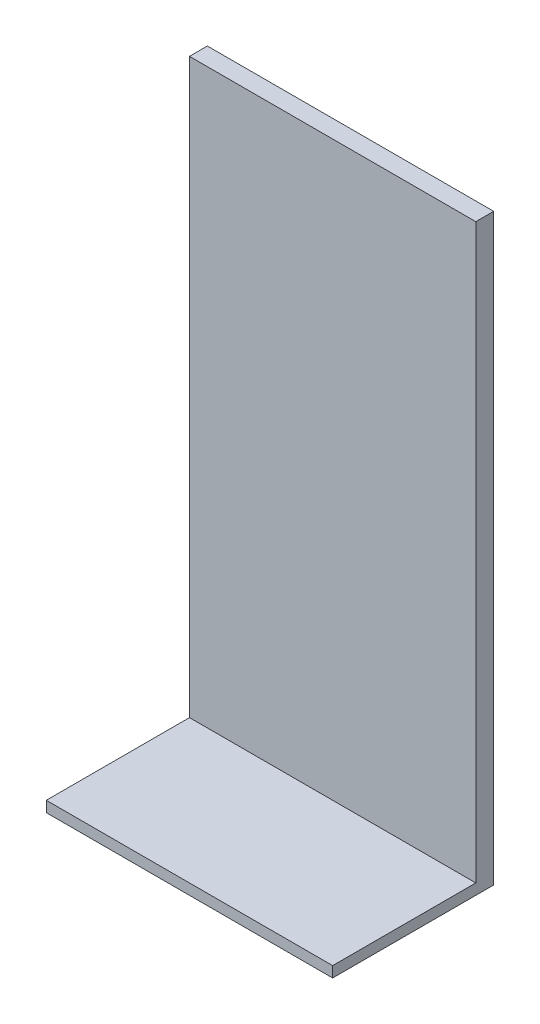
ISO-10303-21;
HEADER;
FILE_DESCRIPTION(('STEP AP214'),'2;1');
FILE_NAME('part.step','',(''),(''),'','','');
FILE_SCHEMA(('AUTOMOTIVE_DESIGN { 1 0 10303 214 1 1 1 1 }'));
ENDSEC;
DATA;
#1=APPLICATION_CONTEXT('core data for automotive mechanical design processes');
#2=APPLICATION_PROTOCOL_DEFINITION('international standard','automotive_design',2000,#1);
#3=PRODUCT_CONTEXT('',#1,'mechanical');
#4=PRODUCT('Part','Part','',(#3));
#5=PRODUCT_RELATED_PRODUCT_CATEGORY('part','',(#4));
#6=PRODUCT_DEFINITION_FORMATION('','',#4);
#7=PRODUCT_DEFINITION_CONTEXT('part definition',#1,'design');
#8=PRODUCT_DEFINITION('design','',#6,#7);
#9=PRODUCT_DEFINITION_SHAPE('','',#8);
#10=(LENGTH_UNIT() NAMED_UNIT(*) SI_UNIT(.MILLI.,.METRE.));
#11=(NAMED_UNIT(*) PLANE_ANGLE_UNIT() SI_UNIT($,.RADIAN.));
#12=(NAMED_UNIT(*) SI_UNIT($,.STERADIAN.) SOLID_ANGLE_UNIT());
#13=UNCERTAINTY_MEASURE_WITH_UNIT(LENGTH_MEASURE(1.E-05),#10,'distance_accuracy_value','');
#14=(GEOMETRIC_REPRESENTATION_CONTEXT(3) GLOBAL_UNCERTAINTY_ASSIGNED_CONTEXT((#13)) GLOBAL_UNIT_ASSIGNED_CONTEXT((#10,
#11,#12)) REPRESENTATION_CONTEXT('',''));
#15=CARTESIAN_POINT('',(0.,0.,0.));
#16=DIRECTION('',(0.,0.,1.));
#17=DIRECTION('',(1.,0.,0.));
#18=AXIS2_PLACEMENT_3D('',#15,#16,#17);
#19=CARTESIAN_POINT('',(80.,163.,0.));
#20=DIRECTION('',(0.,0.,1.));
#21=DIRECTION('',(0.,-1.,0.));
#22=AXIS2_PLACEMENT_3D('',#19,#20,#21);
#23=PLANE('',#22);
#24=DIRECTION('',(0.,1.,0.));
#25=VECTOR('',#24,1.);
#26=CARTESIAN_POINT('',(0.,163.,0.));
#27=LINE('',#26,#25);
#28=CARTESIAN_POINT('',(0.,0.,0.));
#29=VERTEX_POINT('',#28);
#30=CARTESIAN_POINT('',(0.,163.,0.));
#31=VERTEX_POINT('',#30);
#32=EDGE_CURVE('E117',#29,#31,#27,.T.);
#33=ORIENTED_EDGE('',*,*,#32,.T.);
#34=DIRECTION('',(-1.,0.,0.));
#35=VECTOR('',#34,1.);
#36=CARTESIAN_POINT('',(80.,163.,0.));
#37=LINE('',#36,#35);
#38=CARTESIAN_POINT('',(80.,163.,0.));
#39=VERTEX_POINT('',#38);
#40=EDGE_CURVE('E11',#39,#31,#37,.T.);
#41=ORIENTED_EDGE('',*,*,#40,.F.);
#42=DIRECTION('',(0.,1.,0.));
#43=VECTOR('',#42,1.);
#44=CARTESIAN_POINT('',(80.,163.,0.));
#45=LINE('',#44,#43);
#46=CARTESIAN_POINT('',(80.,0.,0.));
#47=VERTEX_POINT('',#46);
#48=EDGE_CURVE('E127',#47,#39,#45,.T.);
#49=ORIENTED_EDGE('',*,*,#48,.F.);
#50=DIRECTION('',(-1.,0.,0.));
#51=VECTOR('',#50,1.);
#52=CARTESIAN_POINT('',(80.,0.,0.));
#53=LINE('',#52,#51);
#54=EDGE_CURVE('E113',#47,#29,#53,.T.);
#55=ORIENTED_EDGE('',*,*,#54,.T.);
#56=EDGE_LOOP('',(#33,#41,#49,#55));
#57=FACE_BOUND('',#56,.T.);
#58=ADVANCED_FACE('F33',(#57),#23,.F.);
#59=CARTESIAN_POINT('',(80.,163.,5.));
#60=DIRECTION('',(0.,-1.,0.));
#61=DIRECTION('',(0.,0.,-1.));
#62=AXIS2_PLACEMENT_3D('',#59,#60,#61);
#63=PLANE('',#62);
#64=DIRECTION('',(0.,0.,1.));
#65=VECTOR('',#64,1.);
#66=CARTESIAN_POINT('',(0.,163.,5.));
#67=LINE('',#66,#65);
#68=CARTESIAN_POINT('',(0.,163.,5.));
#69=VERTEX_POINT('',#68);
#70=EDGE_CURVE('E120',#31,#69,#67,.T.);
#71=ORIENTED_EDGE('',*,*,#70,.T.);
#72=DIRECTION('',(-1.,0.,0.));
#73=VECTOR('',#72,1.);
#74=CARTESIAN_POINT('',(80.,163.,5.));
#75=LINE('',#74,#73);
#76=CARTESIAN_POINT('',(80.,163.,5.));
#77=VERTEX_POINT('',#76);
#78=EDGE_CURVE('E41',#77,#69,#75,.T.);
#79=ORIENTED_EDGE('',*,*,#78,.F.);
#80=DIRECTION('',(0.,0.,1.));
#81=VECTOR('',#80,1.);
#82=CARTESIAN_POINT('',(80.,163.,5.));
#83=LINE('',#82,#81);
#84=EDGE_CURVE('E86',#39,#77,#83,.T.);
#85=ORIENTED_EDGE('',*,*,#84,.F.);
#86=ORIENTED_EDGE('',*,*,#40,.T.);
#87=EDGE_LOOP('',(#71,#79,#85,#86));
#88=FACE_BOUND('',#87,.T.);
#89=ADVANCED_FACE('F151',(#88),#63,.F.);
#90=CARTESIAN_POINT('',(80.,2.99999999999999,5.));
#91=DIRECTION('',(0.,0.,-1.));
#92=DIRECTION('',(0.,1.,0.));
#93=AXIS2_PLACEMENT_3D('',#90,#91,#92);
#94=PLANE('',#93);
#95=DIRECTION('',(0.,-1.,0.));
#96=VECTOR('',#95,1.);
#97=CARTESIAN_POINT('',(0.,2.99999999999999,5.));
#98=LINE('',#97,#96);
#99=CARTESIAN_POINT('',(0.,2.99999999999999,5.));
#100=VERTEX_POINT('',#99);
#101=EDGE_CURVE('E122',#69,#100,#98,.T.);
#102=ORIENTED_EDGE('',*,*,#101,.T.);
#103=DIRECTION('',(-1.,0.,0.));
#104=VECTOR('',#103,1.);
#105=CARTESIAN_POINT('',(80.,2.99999999999999,5.));
#106=LINE('',#105,#104);
#107=CARTESIAN_POINT('',(80.,2.99999999999999,5.));
#108=VERTEX_POINT('',#107);
#109=EDGE_CURVE('E108',#108,#100,#106,.T.);
#110=ORIENTED_EDGE('',*,*,#109,.F.);
#111=DIRECTION('',(0.,-1.,0.));
#112=VECTOR('',#111,1.);
#113=CARTESIAN_POINT('',(80.,2.99999999999999,5.));
#114=LINE('',#113,#112);
#115=EDGE_CURVE('E99',#77,#108,#114,.T.);
#116=ORIENTED_EDGE('',*,*,#115,.F.);
#117=ORIENTED_EDGE('',*,*,#78,.T.);
#118=EDGE_LOOP('',(#102,#110,#116,#117));
#119=FACE_BOUND('',#118,.T.);
#120=ADVANCED_FACE('F133',(#119),#94,.F.);
#121=CARTESIAN_POINT('',(80.,2.99999999999999,45.));
#122=DIRECTION('',(0.,-1.,0.));
#123=DIRECTION('',(0.,0.,-1.));
#124=AXIS2_PLACEMENT_3D('',#121,#122,#123);
#125=PLANE('',#124);
#126=DIRECTION('',(0.,0.,1.));
#127=VECTOR('',#126,1.);
#128=CARTESIAN_POINT('',(0.,2.99999999999999,45.));
#129=LINE('',#128,#127);
#130=CARTESIAN_POINT('',(0.,2.99999999999999,45.));
#131=VERTEX_POINT('',#130);
#132=EDGE_CURVE('E107',#100,#131,#129,.T.);
#133=ORIENTED_EDGE('',*,*,#132,.T.);
#134=DIRECTION('',(-1.,0.,0.));
#135=VECTOR('',#134,1.);
#136=CARTESIAN_POINT('',(80.,2.99999999999999,45.));
#137=LINE('',#136,#135);
#138=CARTESIAN_POINT('',(80.,2.99999999999999,45.));
#139=VERTEX_POINT('',#138);
#140=EDGE_CURVE('E104',#139,#131,#137,.T.);
#141=ORIENTED_EDGE('',*,*,#140,.F.);
#142=DIRECTION('',(0.,0.,1.));
#143=VECTOR('',#142,1.);
#144=CARTESIAN_POINT('',(80.,2.99999999999999,45.));
#145=LINE('',#144,#143);
#146=EDGE_CURVE('E93',#108,#139,#145,.T.);
#147=ORIENTED_EDGE('',*,*,#146,.F.);
#148=ORIENTED_EDGE('',*,*,#109,.T.);
#149=EDGE_LOOP('',(#133,#141,#147,#148));
#150=FACE_BOUND('',#149,.T.);
#151=ADVANCED_FACE('F105',(#150),#125,.F.);
#152=CARTESIAN_POINT('',(80.,0.,45.));
#153=DIRECTION('',(0.,0.,-1.));
#154=DIRECTION('',(-1.,0.,0.));
#155=AXIS2_PLACEMENT_3D('',#152,#153,#154);
#156=PLANE('',#155);
#157=DIRECTION('',(0.,-1.,0.));
#158=VECTOR('',#157,1.);
#159=CARTESIAN_POINT('',(0.,0.,45.));
#160=LINE('',#159,#158);
#161=CARTESIAN_POINT('',(0.,0.,45.));
#162=VERTEX_POINT('',#161);
#163=EDGE_CURVE('E72',#131,#162,#160,.T.);
#164=ORIENTED_EDGE('',*,*,#163,.T.);
#165=DIRECTION('',(-1.,0.,0.));
#166=VECTOR('',#165,1.);
#167=CARTESIAN_POINT('',(80.,0.,45.));
#168=LINE('',#167,#166);
#169=CARTESIAN_POINT('',(80.,0.,45.));
#170=VERTEX_POINT('',#169);
#171=EDGE_CURVE('E109',#170,#162,#168,.T.);
#172=ORIENTED_EDGE('',*,*,#171,.F.);
#173=DIRECTION('',(0.,-1.,0.));
#174=VECTOR('',#173,1.);
#175=CARTESIAN_POINT('',(80.,0.,45.));
#176=LINE('',#175,#174);
#177=EDGE_CURVE('E97',#139,#170,#176,.T.);
#178=ORIENTED_EDGE('',*,*,#177,.F.);
#179=ORIENTED_EDGE('',*,*,#140,.T.);
#180=EDGE_LOOP('',(#164,#172,#178,#179));
#181=FACE_BOUND('',#180,.T.);
#182=ADVANCED_FACE('F111',(#181),#156,.F.);
#183=CARTESIAN_POINT('',(80.,0.,0.));
#184=DIRECTION('',(0.,1.,0.));
#185=DIRECTION('',(0.,0.,1.));
#186=AXIS2_PLACEMENT_3D('',#183,#184,#185);
#187=PLANE('',#186);
#188=DIRECTION('',(0.,0.,-1.));
#189=VECTOR('',#188,1.);
#190=CARTESIAN_POINT('',(0.,0.,0.));
#191=LINE('',#190,#189);
#192=EDGE_CURVE('E78',#162,#29,#191,.T.);
#193=ORIENTED_EDGE('',*,*,#192,.T.);
#194=ORIENTED_EDGE('',*,*,#54,.F.);
#195=DIRECTION('',(0.,0.,-1.));
#196=VECTOR('',#195,1.);
#197=CARTESIAN_POINT('',(80.,0.,0.));
#198=LINE('',#197,#196);
#199=EDGE_CURVE('E49',#170,#47,#198,.T.);
#200=ORIENTED_EDGE('',*,*,#199,.F.);
#201=ORIENTED_EDGE('',*,*,#171,.T.);
#202=EDGE_LOOP('',(#193,#194,#200,#201));
#203=FACE_BOUND('',#202,.T.);
#204=ADVANCED_FACE('F140',(#203),#187,.F.);
#205=CARTESIAN_POINT('',(80.,0.,0.));
#206=DIRECTION('',(-1.,0.,0.));
#207=DIRECTION('',(0.,0.,1.));
#208=AXIS2_PLACEMENT_3D('',#205,#206,#207);
#209=PLANE('',#208);
#210=ORIENTED_EDGE('',*,*,#48,.T.);
#211=ORIENTED_EDGE('',*,*,#84,.T.);
#212=ORIENTED_EDGE('',*,*,#115,.T.);
#213=ORIENTED_EDGE('',*,*,#146,.T.);
#214=ORIENTED_EDGE('',*,*,#177,.T.);
#215=ORIENTED_EDGE('',*,*,#199,.T.);
#216=EDGE_LOOP('',(#210,#211,#212,#213,#214,#215));
#217=FACE_BOUND('',#216,.T.);
#218=ADVANCED_FACE('F95',(#217),#209,.F.);
#219=CARTESIAN_POINT('',(0.,0.,0.));
#220=DIRECTION('',(-1.,0.,0.));
#221=DIRECTION('',(0.,0.,1.));
#222=AXIS2_PLACEMENT_3D('',#219,#220,#221);
#223=PLANE('',#222);
#224=ORIENTED_EDGE('',*,*,#32,.F.);
#225=ORIENTED_EDGE('',*,*,#192,.F.);
#226=ORIENTED_EDGE('',*,*,#163,.F.);
#227=ORIENTED_EDGE('',*,*,#132,.F.);
#228=ORIENTED_EDGE('',*,*,#101,.F.);
#229=ORIENTED_EDGE('',*,*,#70,.F.);
#230=EDGE_LOOP('',(#224,#225,#226,#227,#228,#229));
#231=FACE_BOUND('',#230,.T.);
#232=ADVANCED_FACE('F136',(#231),#223,.T.);
#233=CLOSED_SHELL('',(#58,#89,#120,#151,#182,#204,#218,#232));
#234=MANIFOLD_SOLID_BREP('B2',#233);
#235=ADVANCED_BREP_SHAPE_REPRESENTATION('',(#18,#234),#14);
#236=SHAPE_DEFINITION_REPRESENTATION(#9,#235);
ENDSEC;
END-ISO-10303-21;
